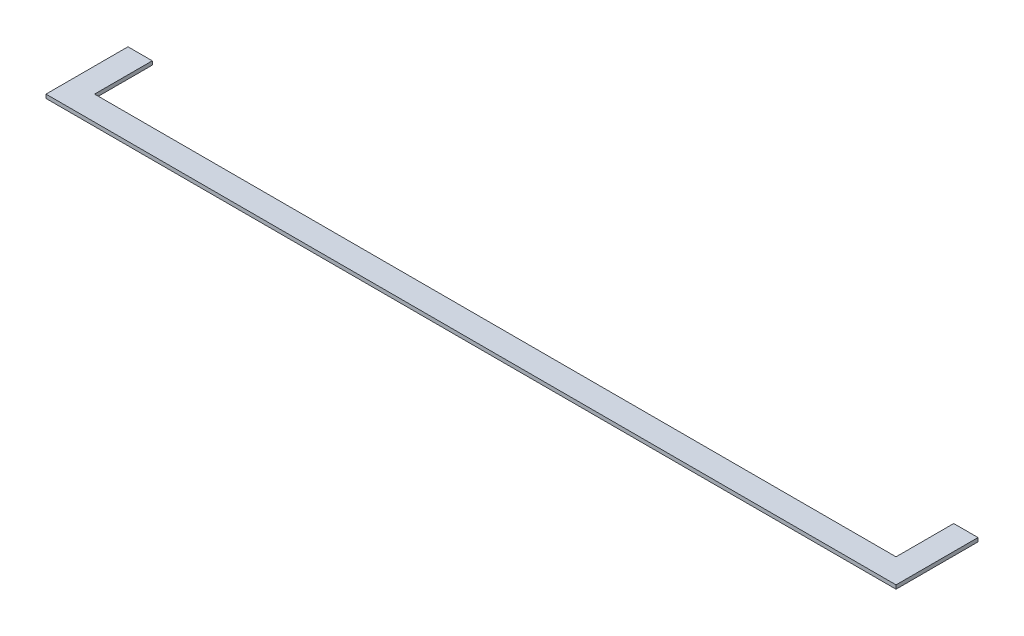
ISO-10303-21;
HEADER;
FILE_DESCRIPTION(('STEP AP214'),'2;1');
FILE_NAME('part.step','',(''),(''),'','','');
FILE_SCHEMA(('AUTOMOTIVE_DESIGN { 1 0 10303 214 1 1 1 1 }'));
ENDSEC;
DATA;
#1=APPLICATION_CONTEXT('core data for automotive mechanical design processes');
#2=APPLICATION_PROTOCOL_DEFINITION('international standard','automotive_design',2000,#1);
#3=PRODUCT_CONTEXT('',#1,'mechanical');
#4=PRODUCT('Part','Part','',(#3));
#5=PRODUCT_RELATED_PRODUCT_CATEGORY('part','',(#4));
#6=PRODUCT_DEFINITION_FORMATION('','',#4);
#7=PRODUCT_DEFINITION_CONTEXT('part definition',#1,'design');
#8=PRODUCT_DEFINITION('design','',#6,#7);
#9=PRODUCT_DEFINITION_SHAPE('','',#8);
#10=(LENGTH_UNIT() NAMED_UNIT(*) SI_UNIT(.MILLI.,.METRE.));
#11=(NAMED_UNIT(*) PLANE_ANGLE_UNIT() SI_UNIT($,.RADIAN.));
#12=(NAMED_UNIT(*) SI_UNIT($,.STERADIAN.) SOLID_ANGLE_UNIT());
#13=UNCERTAINTY_MEASURE_WITH_UNIT(LENGTH_MEASURE(1.E-05),#10,'distance_accuracy_value','');
#14=(GEOMETRIC_REPRESENTATION_CONTEXT(3) GLOBAL_UNCERTAINTY_ASSIGNED_CONTEXT((#13)) GLOBAL_UNIT_ASSIGNED_CONTEXT((#10,
#11,#12)) REPRESENTATION_CONTEXT('',''));
#15=CARTESIAN_POINT('',(0.,0.,0.));
#16=DIRECTION('',(0.,0.,1.));
#17=DIRECTION('',(1.,0.,0.));
#18=AXIS2_PLACEMENT_3D('',#15,#16,#17);
#19=CARTESIAN_POINT('',(0.,1.25,0.));
#20=DIRECTION('',(1.,0.,0.));
#21=DIRECTION('',(0.,0.,-1.));
#22=AXIS2_PLACEMENT_3D('',#19,#20,#21);
#23=PLANE('',#22);
#24=DIRECTION('',(0.,0.,1.));
#25=VECTOR('',#24,1.);
#26=CARTESIAN_POINT('',(0.,0.,0.));
#27=LINE('',#26,#25);
#28=CARTESIAN_POINT('',(0.,0.,-27.));
#29=VERTEX_POINT('',#28);
#30=CARTESIAN_POINT('',(0.,0.,0.));
#31=VERTEX_POINT('',#30);
#32=EDGE_CURVE('E140',#29,#31,#27,.T.);
#33=ORIENTED_EDGE('',*,*,#32,.T.);
#34=DIRECTION('',(0.,-1.,0.));
#35=VECTOR('',#34,1.);
#36=CARTESIAN_POINT('',(0.,1.25,0.));
#37=LINE('',#36,#35);
#38=CARTESIAN_POINT('',(0.,1.25,0.));
#39=VERTEX_POINT('',#38);
#40=EDGE_CURVE('E11',#39,#31,#37,.T.);
#41=ORIENTED_EDGE('',*,*,#40,.F.);
#42=DIRECTION('',(0.,0.,1.));
#43=VECTOR('',#42,1.);
#44=CARTESIAN_POINT('',(0.,1.25,0.));
#45=LINE('',#44,#43);
#46=CARTESIAN_POINT('',(0.,1.25,-27.));
#47=VERTEX_POINT('',#46);
#48=EDGE_CURVE('E162',#47,#39,#45,.T.);
#49=ORIENTED_EDGE('',*,*,#48,.F.);
#50=DIRECTION('',(0.,-1.,0.));
#51=VECTOR('',#50,1.);
#52=CARTESIAN_POINT('',(0.,1.25,-27.));
#53=LINE('',#52,#51);
#54=EDGE_CURVE('E136',#47,#29,#53,.T.);
#55=ORIENTED_EDGE('',*,*,#54,.T.);
#56=EDGE_LOOP('',(#33,#41,#49,#55));
#57=FACE_BOUND('',#56,.T.);
#58=ADVANCED_FACE('F39',(#57),#23,.F.);
#59=CARTESIAN_POINT('',(0.,1.25,0.));
#60=DIRECTION('',(0.,0.,-1.));
#61=DIRECTION('',(-1.,0.,0.));
#62=AXIS2_PLACEMENT_3D('',#59,#60,#61);
#63=PLANE('',#62);
#64=DIRECTION('',(1.,0.,0.));
#65=VECTOR('',#64,1.);
#66=CARTESIAN_POINT('',(0.,0.,0.));
#67=LINE('',#66,#65);
#68=CARTESIAN_POINT('',(280.,0.,0.));
#69=VERTEX_POINT('',#68);
#70=EDGE_CURVE('E144',#31,#69,#67,.T.);
#71=ORIENTED_EDGE('',*,*,#70,.T.);
#72=DIRECTION('',(0.,-1.,0.));
#73=VECTOR('',#72,1.);
#74=CARTESIAN_POINT('',(280.,1.25,0.));
#75=LINE('',#74,#73);
#76=CARTESIAN_POINT('',(280.,1.25,0.));
#77=VERTEX_POINT('',#76);
#78=EDGE_CURVE('E48',#77,#69,#75,.T.);
#79=ORIENTED_EDGE('',*,*,#78,.F.);
#80=DIRECTION('',(1.,0.,0.));
#81=VECTOR('',#80,1.);
#82=CARTESIAN_POINT('',(0.,1.25,0.));
#83=LINE('',#82,#81);
#84=EDGE_CURVE('E99',#39,#77,#83,.T.);
#85=ORIENTED_EDGE('',*,*,#84,.F.);
#86=ORIENTED_EDGE('',*,*,#40,.T.);
#87=EDGE_LOOP('',(#71,#79,#85,#86));
#88=FACE_BOUND('',#87,.T.);
#89=ADVANCED_FACE('F208',(#88),#63,.F.);
#90=CARTESIAN_POINT('',(280.,1.25,0.));
#91=DIRECTION('',(-1.,0.,0.));
#92=DIRECTION('',(0.,0.,1.));
#93=AXIS2_PLACEMENT_3D('',#90,#91,#92);
#94=PLANE('',#93);
#95=DIRECTION('',(0.,0.,-1.));
#96=VECTOR('',#95,1.);
#97=CARTESIAN_POINT('',(280.,0.,0.));
#98=LINE('',#97,#96);
#99=CARTESIAN_POINT('',(280.,0.,-27.));
#100=VERTEX_POINT('',#99);
#101=EDGE_CURVE('E147',#69,#100,#98,.T.);
#102=ORIENTED_EDGE('',*,*,#101,.T.);
#103=DIRECTION('',(0.,-1.,0.));
#104=VECTOR('',#103,1.);
#105=CARTESIAN_POINT('',(280.,1.25,-27.));
#106=LINE('',#105,#104);
#107=CARTESIAN_POINT('',(280.,1.25,-27.));
#108=VERTEX_POINT('',#107);
#109=EDGE_CURVE('E173',#108,#100,#106,.T.);
#110=ORIENTED_EDGE('',*,*,#109,.F.);
#111=DIRECTION('',(0.,0.,-1.));
#112=VECTOR('',#111,1.);
#113=CARTESIAN_POINT('',(280.,1.25,0.));
#114=LINE('',#113,#112);
#115=EDGE_CURVE('E183',#77,#108,#114,.T.);
#116=ORIENTED_EDGE('',*,*,#115,.F.);
#117=ORIENTED_EDGE('',*,*,#78,.T.);
#118=EDGE_LOOP('',(#102,#110,#116,#117));
#119=FACE_BOUND('',#118,.T.);
#120=ADVANCED_FACE('F181',(#119),#94,.F.);
#121=CARTESIAN_POINT('',(272.,1.25,-27.));
#122=DIRECTION('',(0.,0.,1.));
#123=DIRECTION('',(1.,0.,0.));
#124=AXIS2_PLACEMENT_3D('',#121,#122,#123);
#125=PLANE('',#124);
#126=DIRECTION('',(-1.,0.,0.));
#127=VECTOR('',#126,1.);
#128=CARTESIAN_POINT('',(272.,0.,-27.));
#129=LINE('',#128,#127);
#130=CARTESIAN_POINT('',(272.,0.,-27.));
#131=VERTEX_POINT('',#130);
#132=EDGE_CURVE('E150',#100,#131,#129,.T.);
#133=ORIENTED_EDGE('',*,*,#132,.T.);
#134=DIRECTION('',(0.,-1.,0.));
#135=VECTOR('',#134,1.);
#136=CARTESIAN_POINT('',(272.,1.25,-27.));
#137=LINE('',#136,#135);
#138=CARTESIAN_POINT('',(272.,1.25,-27.));
#139=VERTEX_POINT('',#138);
#140=EDGE_CURVE('E169',#139,#131,#137,.T.);
#141=ORIENTED_EDGE('',*,*,#140,.F.);
#142=DIRECTION('',(-1.,0.,0.));
#143=VECTOR('',#142,1.);
#144=CARTESIAN_POINT('',(272.,1.25,-27.));
#145=LINE('',#144,#143);
#146=EDGE_CURVE('E196',#108,#139,#145,.T.);
#147=ORIENTED_EDGE('',*,*,#146,.F.);
#148=ORIENTED_EDGE('',*,*,#109,.T.);
#149=EDGE_LOOP('',(#133,#141,#147,#148));
#150=FACE_BOUND('',#149,.T.);
#151=ADVANCED_FACE('F191',(#150),#125,.F.);
#152=CARTESIAN_POINT('',(272.,1.25,-8.));
#153=DIRECTION('',(1.,0.,0.));
#154=DIRECTION('',(0.,0.,-1.));
#155=AXIS2_PLACEMENT_3D('',#152,#153,#154);
#156=PLANE('',#155);
#157=DIRECTION('',(0.,0.,1.));
#158=VECTOR('',#157,1.);
#159=CARTESIAN_POINT('',(272.,0.,-8.));
#160=LINE('',#159,#158);
#161=CARTESIAN_POINT('',(272.,0.,-8.));
#162=VERTEX_POINT('',#161);
#163=EDGE_CURVE('E153',#131,#162,#160,.T.);
#164=ORIENTED_EDGE('',*,*,#163,.T.);
#165=DIRECTION('',(0.,-1.,0.));
#166=VECTOR('',#165,1.);
#167=CARTESIAN_POINT('',(272.,1.25,-8.));
#168=LINE('',#167,#166);
#169=CARTESIAN_POINT('',(272.,1.25,-8.));
#170=VERTEX_POINT('',#169);
#171=EDGE_CURVE('E129',#170,#162,#168,.T.);
#172=ORIENTED_EDGE('',*,*,#171,.F.);
#173=DIRECTION('',(0.,0.,1.));
#174=VECTOR('',#173,1.);
#175=CARTESIAN_POINT('',(272.,1.25,-8.));
#176=LINE('',#175,#174);
#177=EDGE_CURVE('E118',#139,#170,#176,.T.);
#178=ORIENTED_EDGE('',*,*,#177,.F.);
#179=ORIENTED_EDGE('',*,*,#140,.T.);
#180=EDGE_LOOP('',(#164,#172,#178,#179));
#181=FACE_BOUND('',#180,.T.);
#182=ADVANCED_FACE('F194',(#181),#156,.F.);
#183=CARTESIAN_POINT('',(8.,1.25,-8.));
#184=DIRECTION('',(0.,0.,1.));
#185=DIRECTION('',(1.,0.,0.));
#186=AXIS2_PLACEMENT_3D('',#183,#184,#185);
#187=PLANE('',#186);
#188=DIRECTION('',(-1.,0.,0.));
#189=VECTOR('',#188,1.);
#190=CARTESIAN_POINT('',(8.,0.,-8.));
#191=LINE('',#190,#189);
#192=CARTESIAN_POINT('',(8.,0.,-8.));
#193=VERTEX_POINT('',#192);
#194=EDGE_CURVE('E127',#162,#193,#191,.T.);
#195=ORIENTED_EDGE('',*,*,#194,.T.);
#196=DIRECTION('',(0.,-1.,0.));
#197=VECTOR('',#196,1.);
#198=CARTESIAN_POINT('',(8.,1.25,-8.));
#199=LINE('',#198,#197);
#200=CARTESIAN_POINT('',(8.,1.25,-8.));
#201=VERTEX_POINT('',#200);
#202=EDGE_CURVE('E124',#201,#193,#199,.T.);
#203=ORIENTED_EDGE('',*,*,#202,.F.);
#204=DIRECTION('',(-1.,0.,0.));
#205=VECTOR('',#204,1.);
#206=CARTESIAN_POINT('',(8.,1.25,-8.));
#207=LINE('',#206,#205);
#208=EDGE_CURVE('E112',#170,#201,#207,.T.);
#209=ORIENTED_EDGE('',*,*,#208,.F.);
#210=ORIENTED_EDGE('',*,*,#171,.T.);
#211=EDGE_LOOP('',(#195,#203,#209,#210));
#212=FACE_BOUND('',#211,.T.);
#213=ADVANCED_FACE('F125',(#212),#187,.F.);
#214=CARTESIAN_POINT('',(8.,1.25,-8.));
#215=DIRECTION('',(-1.,0.,0.));
#216=DIRECTION('',(0.,0.,1.));
#217=AXIS2_PLACEMENT_3D('',#214,#215,#216);
#218=PLANE('',#217);
#219=DIRECTION('',(0.,0.,-1.));
#220=VECTOR('',#219,1.);
#221=CARTESIAN_POINT('',(8.,0.,-8.));
#222=LINE('',#221,#220);
#223=CARTESIAN_POINT('',(8.,0.,-27.));
#224=VERTEX_POINT('',#223);
#225=EDGE_CURVE('E85',#193,#224,#222,.T.);
#226=ORIENTED_EDGE('',*,*,#225,.T.);
#227=DIRECTION('',(0.,-1.,0.));
#228=VECTOR('',#227,1.);
#229=CARTESIAN_POINT('',(8.,1.25,-27.));
#230=LINE('',#229,#228);
#231=CARTESIAN_POINT('',(8.,1.25,-27.));
#232=VERTEX_POINT('',#231);
#233=EDGE_CURVE('E130',#232,#224,#230,.T.);
#234=ORIENTED_EDGE('',*,*,#233,.F.);
#235=DIRECTION('',(0.,0.,-1.));
#236=VECTOR('',#235,1.);
#237=CARTESIAN_POINT('',(8.,1.25,-8.));
#238=LINE('',#237,#236);
#239=EDGE_CURVE('E116',#201,#232,#238,.T.);
#240=ORIENTED_EDGE('',*,*,#239,.F.);
#241=ORIENTED_EDGE('',*,*,#202,.T.);
#242=EDGE_LOOP('',(#226,#234,#240,#241));
#243=FACE_BOUND('',#242,.T.);
#244=ADVANCED_FACE('F132',(#243),#218,.F.);
#245=CARTESIAN_POINT('',(0.,1.25,-27.));
#246=DIRECTION('',(0.,0.,1.));
#247=DIRECTION('',(1.,0.,0.));
#248=AXIS2_PLACEMENT_3D('',#245,#246,#247);
#249=PLANE('',#248);
#250=DIRECTION('',(-1.,0.,0.));
#251=VECTOR('',#250,1.);
#252=CARTESIAN_POINT('',(0.,0.,-27.));
#253=LINE('',#252,#251);
#254=EDGE_CURVE('E91',#224,#29,#253,.T.);
#255=ORIENTED_EDGE('',*,*,#254,.T.);
#256=ORIENTED_EDGE('',*,*,#54,.F.);
#257=DIRECTION('',(-1.,0.,0.));
#258=VECTOR('',#257,1.);
#259=CARTESIAN_POINT('',(0.,1.25,-27.));
#260=LINE('',#259,#258);
#261=EDGE_CURVE('E56',#232,#47,#260,.T.);
#262=ORIENTED_EDGE('',*,*,#261,.F.);
#263=ORIENTED_EDGE('',*,*,#233,.T.);
#264=EDGE_LOOP('',(#255,#256,#262,#263));
#265=FACE_BOUND('',#264,.T.);
#266=ADVANCED_FACE('F224',(#265),#249,.F.);
#267=CARTESIAN_POINT('',(0.,1.25,0.));
#268=DIRECTION('',(0.,-1.,0.));
#269=DIRECTION('',(0.,0.,-1.));
#270=AXIS2_PLACEMENT_3D('',#267,#268,#269);
#271=PLANE('',#270);
#272=ORIENTED_EDGE('',*,*,#48,.T.);
#273=ORIENTED_EDGE('',*,*,#84,.T.);
#274=ORIENTED_EDGE('',*,*,#115,.T.);
#275=ORIENTED_EDGE('',*,*,#146,.T.);
#276=ORIENTED_EDGE('',*,*,#177,.T.);
#277=ORIENTED_EDGE('',*,*,#208,.T.);
#278=ORIENTED_EDGE('',*,*,#239,.T.);
#279=ORIENTED_EDGE('',*,*,#261,.T.);
#280=EDGE_LOOP('',(#272,#273,#274,#275,#276,#277,#278,#279));
#281=FACE_BOUND('',#280,.T.);
#282=ADVANCED_FACE('F114',(#281),#271,.F.);
#283=CARTESIAN_POINT('',(0.,0.,0.));
#284=DIRECTION('',(0.,-1.,0.));
#285=DIRECTION('',(0.,0.,-1.));
#286=AXIS2_PLACEMENT_3D('',#283,#284,#285);
#287=PLANE('',#286);
#288=ORIENTED_EDGE('',*,*,#32,.F.);
#289=ORIENTED_EDGE('',*,*,#254,.F.);
#290=ORIENTED_EDGE('',*,*,#225,.F.);
#291=ORIENTED_EDGE('',*,*,#194,.F.);
#292=ORIENTED_EDGE('',*,*,#163,.F.);
#293=ORIENTED_EDGE('',*,*,#132,.F.);
#294=ORIENTED_EDGE('',*,*,#101,.F.);
#295=ORIENTED_EDGE('',*,*,#70,.F.);
#296=EDGE_LOOP('',(#288,#289,#290,#291,#292,#293,#294,#295));
#297=FACE_BOUND('',#296,.T.);
#298=ADVANCED_FACE('F187',(#297),#287,.T.);
#299=CLOSED_SHELL('',(#58,#89,#120,#151,#182,#213,#244,#266,#282,#298));
#300=MANIFOLD_SOLID_BREP('B2',#299);
#301=ADVANCED_BREP_SHAPE_REPRESENTATION('',(#18,#300),#14);
#302=SHAPE_DEFINITION_REPRESENTATION(#9,#301);
ENDSEC;
END-ISO-10303-21;
